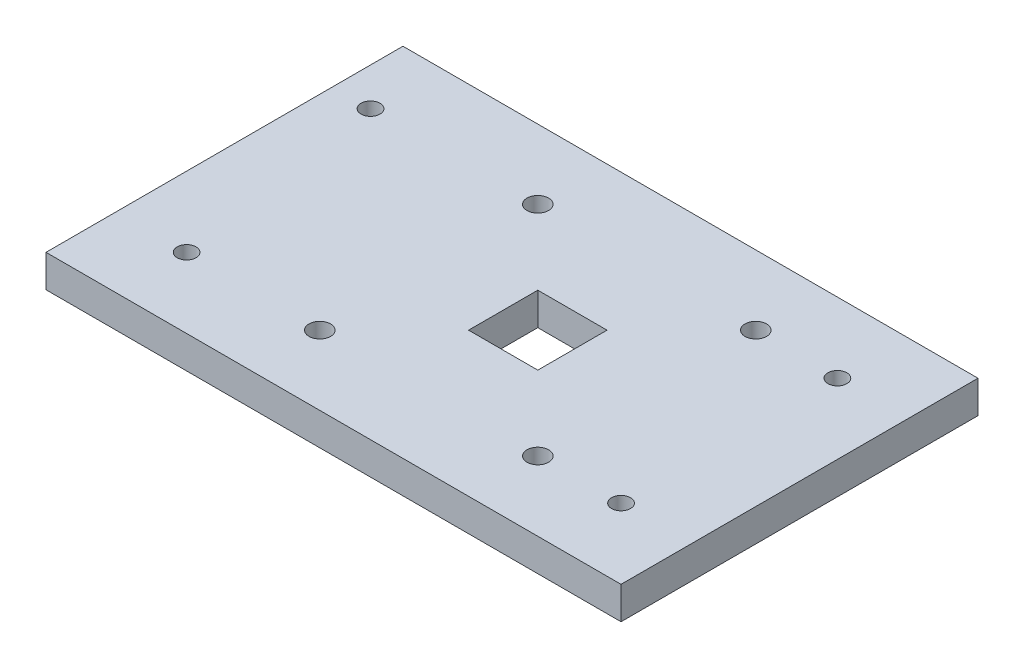
ISO-10303-21;
HEADER;
FILE_DESCRIPTION(('STEP AP214'),'2;1');
FILE_NAME('part.step','',(''),(''),'','','');
FILE_SCHEMA(('AUTOMOTIVE_DESIGN { 1 0 10303 214 1 1 1 1 }'));
ENDSEC;
DATA;
#1=APPLICATION_CONTEXT('core data for automotive mechanical design processes');
#2=APPLICATION_PROTOCOL_DEFINITION('international standard','automotive_design',2000,#1);
#3=PRODUCT_CONTEXT('',#1,'mechanical');
#4=PRODUCT('Part','Part','',(#3));
#5=PRODUCT_RELATED_PRODUCT_CATEGORY('part','',(#4));
#6=PRODUCT_DEFINITION_FORMATION('','',#4);
#7=PRODUCT_DEFINITION_CONTEXT('part definition',#1,'design');
#8=PRODUCT_DEFINITION('design','',#6,#7);
#9=PRODUCT_DEFINITION_SHAPE('','',#8);
#10=(LENGTH_UNIT() NAMED_UNIT(*) SI_UNIT(.MILLI.,.METRE.));
#11=(NAMED_UNIT(*) PLANE_ANGLE_UNIT() SI_UNIT($,.RADIAN.));
#12=(NAMED_UNIT(*) SI_UNIT($,.STERADIAN.) SOLID_ANGLE_UNIT());
#13=UNCERTAINTY_MEASURE_WITH_UNIT(LENGTH_MEASURE(1.E-05),#10,'distance_accuracy_value','');
#14=(GEOMETRIC_REPRESENTATION_CONTEXT(3) GLOBAL_UNCERTAINTY_ASSIGNED_CONTEXT((#13)) GLOBAL_UNIT_ASSIGNED_CONTEXT((#10,
#11,#12)) REPRESENTATION_CONTEXT('',''));
#15=CARTESIAN_POINT('',(0.,0.,0.));
#16=DIRECTION('',(0.,0.,1.));
#17=DIRECTION('',(1.,0.,0.));
#18=AXIS2_PLACEMENT_3D('',#15,#16,#17);
#19=CARTESIAN_POINT('',(0.,6.,0.));
#20=DIRECTION('',(0.,-1.,0.));
#21=DIRECTION('',(0.,0.,-1.));
#22=AXIS2_PLACEMENT_3D('',#19,#20,#21);
#23=PLANE('',#22);
#24=CARTESIAN_POINT('',(35.39,6.,-20.));
#25=DIRECTION('',(0.,1.,0.));
#26=DIRECTION('',(0.,0.,1.));
#27=AXIS2_PLACEMENT_3D('',#24,#25,#26);
#28=CIRCLE('',#27,1.75);
#29=CARTESIAN_POINT('',(35.39,6.,-18.25));
#30=VERTEX_POINT('',#29);
#31=EDGE_CURVE('E255',#30,#30,#28,.T.);
#32=ORIENTED_EDGE('',*,*,#31,.F.);
#33=EDGE_LOOP('',(#32));
#34=FACE_BOUND('',#33,.T.);
#35=CARTESIAN_POINT('',(35.39,6.,20.));
#36=DIRECTION('',(0.,1.,0.));
#37=DIRECTION('',(0.,0.,1.));
#38=AXIS2_PLACEMENT_3D('',#35,#36,#37);
#39=CIRCLE('',#38,1.75);
#40=CARTESIAN_POINT('',(35.39,6.,21.75));
#41=VERTEX_POINT('',#40);
#42=EDGE_CURVE('E257',#41,#41,#39,.T.);
#43=ORIENTED_EDGE('',*,*,#42,.F.);
#44=EDGE_LOOP('',(#43));
#45=FACE_BOUND('',#44,.T.);
#46=CARTESIAN_POINT('',(-44.93,6.,20.));
#47=DIRECTION('',(0.,1.,0.));
#48=DIRECTION('',(0.,0.,1.));
#49=AXIS2_PLACEMENT_3D('',#46,#47,#48);
#50=CIRCLE('',#49,1.75);
#51=CARTESIAN_POINT('',(-44.93,6.,21.75));
#52=VERTEX_POINT('',#51);
#53=EDGE_CURVE('E263',#52,#52,#50,.T.);
#54=ORIENTED_EDGE('',*,*,#53,.F.);
#55=EDGE_LOOP('',(#54));
#56=FACE_BOUND('',#55,.T.);
#57=CARTESIAN_POINT('',(-50.93,6.,-20.));
#58=DIRECTION('',(0.,1.,0.));
#59=DIRECTION('',(0.,0.,1.));
#60=AXIS2_PLACEMENT_3D('',#57,#58,#59);
#61=CIRCLE('',#60,1.75);
#62=CARTESIAN_POINT('',(-50.93,6.,-18.25));
#63=VERTEX_POINT('',#62);
#64=EDGE_CURVE('E269',#63,#63,#61,.T.);
#65=ORIENTED_EDGE('',*,*,#64,.F.);
#66=EDGE_LOOP('',(#65));
#67=FACE_BOUND('',#66,.T.);
#68=CARTESIAN_POINT('',(-20.1525432638164,6.,20.1525432638169));
#69=DIRECTION('',(0.,1.,0.));
#70=DIRECTION('',(0.,0.,1.));
#71=AXIS2_PLACEMENT_3D('',#68,#69,#70);
#72=CIRCLE('',#71,2.);
#73=CARTESIAN_POINT('',(-20.1525432638164,6.,22.1525432638169));
#74=VERTEX_POINT('',#73);
#75=EDGE_CURVE('E284',#74,#74,#72,.T.);
#76=ORIENTED_EDGE('',*,*,#75,.F.);
#77=EDGE_LOOP('',(#76));
#78=FACE_BOUND('',#77,.T.);
#79=CARTESIAN_POINT('',(20.1525432638166,6.,20.1525432638166));
#80=DIRECTION('',(0.,1.,0.));
#81=DIRECTION('',(0.,0.,1.));
#82=AXIS2_PLACEMENT_3D('',#79,#80,#81);
#83=CIRCLE('',#82,2.);
#84=CARTESIAN_POINT('',(20.1525432638166,6.,22.1525432638166));
#85=VERTEX_POINT('',#84);
#86=EDGE_CURVE('E126',#85,#85,#83,.T.);
#87=ORIENTED_EDGE('',*,*,#86,.F.);
#88=EDGE_LOOP('',(#87));
#89=FACE_BOUND('',#88,.T.);
#90=DIRECTION('',(0.,0.,1.));
#91=VECTOR('',#90,1.);
#92=CARTESIAN_POINT('',(-57.93,6.,33.));
#93=LINE('',#92,#91);
#94=CARTESIAN_POINT('',(-57.93,6.,-33.));
#95=VERTEX_POINT('',#94);
#96=CARTESIAN_POINT('',(-57.93,6.,33.));
#97=VERTEX_POINT('',#96);
#98=EDGE_CURVE('E136',#95,#97,#93,.T.);
#99=ORIENTED_EDGE('',*,*,#98,.T.);
#100=DIRECTION('',(1.,0.,0.));
#101=VECTOR('',#100,1.);
#102=CARTESIAN_POINT('',(-57.93,6.,33.));
#103=LINE('',#102,#101);
#104=CARTESIAN_POINT('',(48.39,6.,33.));
#105=VERTEX_POINT('',#104);
#106=EDGE_CURVE('E139',#97,#105,#103,.T.);
#107=ORIENTED_EDGE('',*,*,#106,.T.);
#108=DIRECTION('',(0.,0.,-1.));
#109=VECTOR('',#108,1.);
#110=CARTESIAN_POINT('',(48.39,6.,33.));
#111=LINE('',#110,#109);
#112=CARTESIAN_POINT('',(48.39,6.,-33.));
#113=VERTEX_POINT('',#112);
#114=EDGE_CURVE('E142',#105,#113,#111,.T.);
#115=ORIENTED_EDGE('',*,*,#114,.T.);
#116=DIRECTION('',(-1.,0.,0.));
#117=VECTOR('',#116,1.);
#118=CARTESIAN_POINT('',(-57.93,6.,-33.));
#119=LINE('',#118,#117);
#120=EDGE_CURVE('E144',#113,#95,#119,.T.);
#121=ORIENTED_EDGE('',*,*,#120,.T.);
#122=EDGE_LOOP('',(#99,#107,#115,#121));
#123=FACE_BOUND('',#122,.T.);
#124=DIRECTION('',(0.,0.,1.));
#125=VECTOR('',#124,1.);
#126=CARTESIAN_POINT('',(-6.4,6.,-6.4));
#127=LINE('',#126,#125);
#128=CARTESIAN_POINT('',(-6.4,6.,-6.4));
#129=VERTEX_POINT('',#128);
#130=CARTESIAN_POINT('',(-6.4,6.,6.4));
#131=VERTEX_POINT('',#130);
#132=EDGE_CURVE('E97',#129,#131,#127,.T.);
#133=ORIENTED_EDGE('',*,*,#132,.F.);
#134=DIRECTION('',(-1.,0.,0.));
#135=VECTOR('',#134,1.);
#136=CARTESIAN_POINT('',(-6.4,6.,-6.4));
#137=LINE('',#136,#135);
#138=CARTESIAN_POINT('',(6.4,6.,-6.4));
#139=VERTEX_POINT('',#138);
#140=EDGE_CURVE('E120',#139,#129,#137,.T.);
#141=ORIENTED_EDGE('',*,*,#140,.F.);
#142=DIRECTION('',(0.,0.,-1.));
#143=VECTOR('',#142,1.);
#144=CARTESIAN_POINT('',(6.4,6.,-6.4));
#145=LINE('',#144,#143);
#146=CARTESIAN_POINT('',(6.4,6.,6.4));
#147=VERTEX_POINT('',#146);
#148=EDGE_CURVE('E118',#147,#139,#145,.T.);
#149=ORIENTED_EDGE('',*,*,#148,.F.);
#150=DIRECTION('',(1.,0.,0.));
#151=VECTOR('',#150,1.);
#152=CARTESIAN_POINT('',(-6.4,6.,6.4));
#153=LINE('',#152,#151);
#154=EDGE_CURVE('E105',#131,#147,#153,.T.);
#155=ORIENTED_EDGE('',*,*,#154,.F.);
#156=EDGE_LOOP('',(#133,#141,#149,#155));
#157=FACE_BOUND('',#156,.T.);
#158=CARTESIAN_POINT('',(20.1525432638165,6.,-20.1525432638167));
#159=DIRECTION('',(0.,1.,0.));
#160=DIRECTION('',(0.,0.,1.));
#161=AXIS2_PLACEMENT_3D('',#158,#159,#160);
#162=CIRCLE('',#161,2.00000000000001);
#163=CARTESIAN_POINT('',(20.1525432638165,6.,-18.1525432638167));
#164=VERTEX_POINT('',#163);
#165=EDGE_CURVE('E290',#164,#164,#162,.T.);
#166=ORIENTED_EDGE('',*,*,#165,.F.);
#167=EDGE_LOOP('',(#166));
#168=FACE_BOUND('',#167,.T.);
#169=CARTESIAN_POINT('',(-20.1525432638166,6.,-20.1525432638166));
#170=DIRECTION('',(0.,1.,0.));
#171=DIRECTION('',(0.,0.,1.));
#172=AXIS2_PLACEMENT_3D('',#169,#170,#171);
#173=CIRCLE('',#172,2.);
#174=CARTESIAN_POINT('',(-20.1525432638166,6.,-18.1525432638166));
#175=VERTEX_POINT('',#174);
#176=EDGE_CURVE('E278',#175,#175,#173,.T.);
#177=ORIENTED_EDGE('',*,*,#176,.F.);
#178=EDGE_LOOP('',(#177));
#179=FACE_BOUND('',#178,.T.);
#180=ADVANCED_FACE('F32',(#34,#45,#56,#67,#78,#89,#123,#157,#168,#179),#23,.F.);
#181=CARTESIAN_POINT('',(0.,0.,0.));
#182=DIRECTION('',(0.,-1.,0.));
#183=DIRECTION('',(0.,0.,-1.));
#184=AXIS2_PLACEMENT_3D('',#181,#182,#183);
#185=PLANE('',#184);
#186=CARTESIAN_POINT('',(35.39,0.,-20.));
#187=DIRECTION('',(0.,1.,0.));
#188=DIRECTION('',(0.,0.,1.));
#189=AXIS2_PLACEMENT_3D('',#186,#187,#188);
#190=CIRCLE('',#189,1.75);
#191=CARTESIAN_POINT('',(35.39,0.,-18.25));
#192=VERTEX_POINT('',#191);
#193=EDGE_CURVE('E253',#192,#192,#190,.T.);
#194=ORIENTED_EDGE('',*,*,#193,.T.);
#195=EDGE_LOOP('',(#194));
#196=FACE_BOUND('',#195,.T.);
#197=CARTESIAN_POINT('',(35.39,0.,20.));
#198=DIRECTION('',(0.,1.,0.));
#199=DIRECTION('',(0.,0.,1.));
#200=AXIS2_PLACEMENT_3D('',#197,#198,#199);
#201=CIRCLE('',#200,1.75);
#202=CARTESIAN_POINT('',(35.39,0.,21.75));
#203=VERTEX_POINT('',#202);
#204=EDGE_CURVE('E260',#203,#203,#201,.T.);
#205=ORIENTED_EDGE('',*,*,#204,.T.);
#206=EDGE_LOOP('',(#205));
#207=FACE_BOUND('',#206,.T.);
#208=CARTESIAN_POINT('',(-44.93,0.,20.));
#209=DIRECTION('',(0.,1.,0.));
#210=DIRECTION('',(0.,0.,1.));
#211=AXIS2_PLACEMENT_3D('',#208,#209,#210);
#212=CIRCLE('',#211,1.75);
#213=CARTESIAN_POINT('',(-44.93,0.,21.75));
#214=VERTEX_POINT('',#213);
#215=EDGE_CURVE('E266',#214,#214,#212,.T.);
#216=ORIENTED_EDGE('',*,*,#215,.T.);
#217=EDGE_LOOP('',(#216));
#218=FACE_BOUND('',#217,.T.);
#219=CARTESIAN_POINT('',(-50.93,0.,-20.));
#220=DIRECTION('',(0.,1.,0.));
#221=DIRECTION('',(0.,0.,1.));
#222=AXIS2_PLACEMENT_3D('',#219,#220,#221);
#223=CIRCLE('',#222,1.75);
#224=CARTESIAN_POINT('',(-50.93,0.,-18.25));
#225=VERTEX_POINT('',#224);
#226=EDGE_CURVE('E272',#225,#225,#223,.T.);
#227=ORIENTED_EDGE('',*,*,#226,.T.);
#228=EDGE_LOOP('',(#227));
#229=FACE_BOUND('',#228,.T.);
#230=CARTESIAN_POINT('',(-20.1525432638164,0.,20.1525432638169));
#231=DIRECTION('',(0.,1.,0.));
#232=DIRECTION('',(0.,0.,1.));
#233=AXIS2_PLACEMENT_3D('',#230,#231,#232);
#234=CIRCLE('',#233,2.);
#235=CARTESIAN_POINT('',(-20.1525432638164,0.,22.1525432638169));
#236=VERTEX_POINT('',#235);
#237=EDGE_CURVE('E281',#236,#236,#234,.T.);
#238=ORIENTED_EDGE('',*,*,#237,.T.);
#239=EDGE_LOOP('',(#238));
#240=FACE_BOUND('',#239,.T.);
#241=CARTESIAN_POINT('',(20.1525432638166,0.,20.1525432638166));
#242=DIRECTION('',(0.,1.,0.));
#243=DIRECTION('',(0.,0.,1.));
#244=AXIS2_PLACEMENT_3D('',#241,#242,#243);
#245=CIRCLE('',#244,2.);
#246=CARTESIAN_POINT('',(20.1525432638166,0.,22.1525432638166));
#247=VERTEX_POINT('',#246);
#248=EDGE_CURVE('E293',#247,#247,#245,.T.);
#249=ORIENTED_EDGE('',*,*,#248,.T.);
#250=EDGE_LOOP('',(#249));
#251=FACE_BOUND('',#250,.T.);
#252=DIRECTION('',(0.,0.,1.));
#253=VECTOR('',#252,1.);
#254=CARTESIAN_POINT('',(-57.93,0.,33.));
#255=LINE('',#254,#253);
#256=CARTESIAN_POINT('',(-57.93,0.,-33.));
#257=VERTEX_POINT('',#256);
#258=CARTESIAN_POINT('',(-57.93,0.,33.));
#259=VERTEX_POINT('',#258);
#260=EDGE_CURVE('E113',#257,#259,#255,.T.);
#261=ORIENTED_EDGE('',*,*,#260,.F.);
#262=DIRECTION('',(-1.,0.,0.));
#263=VECTOR('',#262,1.);
#264=CARTESIAN_POINT('',(-57.93,0.,-33.));
#265=LINE('',#264,#263);
#266=CARTESIAN_POINT('',(48.39,0.,-33.));
#267=VERTEX_POINT('',#266);
#268=EDGE_CURVE('E140',#267,#257,#265,.T.);
#269=ORIENTED_EDGE('',*,*,#268,.F.);
#270=DIRECTION('',(0.,0.,-1.));
#271=VECTOR('',#270,1.);
#272=CARTESIAN_POINT('',(48.39,0.,33.));
#273=LINE('',#272,#271);
#274=CARTESIAN_POINT('',(48.39,0.,33.));
#275=VERTEX_POINT('',#274);
#276=EDGE_CURVE('E151',#275,#267,#273,.T.);
#277=ORIENTED_EDGE('',*,*,#276,.F.);
#278=DIRECTION('',(1.,0.,0.));
#279=VECTOR('',#278,1.);
#280=CARTESIAN_POINT('',(-57.93,0.,33.));
#281=LINE('',#280,#279);
#282=EDGE_CURVE('E149',#259,#275,#281,.T.);
#283=ORIENTED_EDGE('',*,*,#282,.F.);
#284=EDGE_LOOP('',(#261,#269,#277,#283));
#285=FACE_BOUND('',#284,.T.);
#286=DIRECTION('',(-1.,0.,0.));
#287=VECTOR('',#286,1.);
#288=CARTESIAN_POINT('',(-6.4,0.,-6.4));
#289=LINE('',#288,#287);
#290=CARTESIAN_POINT('',(6.4,0.,-6.4));
#291=VERTEX_POINT('',#290);
#292=CARTESIAN_POINT('',(-6.4,0.,-6.4));
#293=VERTEX_POINT('',#292);
#294=EDGE_CURVE('E106',#291,#293,#289,.T.);
#295=ORIENTED_EDGE('',*,*,#294,.T.);
#296=DIRECTION('',(0.,0.,1.));
#297=VECTOR('',#296,1.);
#298=CARTESIAN_POINT('',(-6.4,0.,-6.4));
#299=LINE('',#298,#297);
#300=CARTESIAN_POINT('',(-6.4,0.,6.4));
#301=VERTEX_POINT('',#300);
#302=EDGE_CURVE('E55',#293,#301,#299,.T.);
#303=ORIENTED_EDGE('',*,*,#302,.T.);
#304=DIRECTION('',(1.,0.,0.));
#305=VECTOR('',#304,1.);
#306=CARTESIAN_POINT('',(-6.4,0.,6.4));
#307=LINE('',#306,#305);
#308=CARTESIAN_POINT('',(6.4,0.,6.4));
#309=VERTEX_POINT('',#308);
#310=EDGE_CURVE('E112',#301,#309,#307,.T.);
#311=ORIENTED_EDGE('',*,*,#310,.T.);
#312=DIRECTION('',(0.,0.,-1.));
#313=VECTOR('',#312,1.);
#314=CARTESIAN_POINT('',(6.4,0.,-6.4));
#315=LINE('',#314,#313);
#316=EDGE_CURVE('E128',#309,#291,#315,.T.);
#317=ORIENTED_EDGE('',*,*,#316,.T.);
#318=EDGE_LOOP('',(#295,#303,#311,#317));
#319=FACE_BOUND('',#318,.T.);
#320=CARTESIAN_POINT('',(20.1525432638165,0.,-20.1525432638167));
#321=DIRECTION('',(0.,1.,0.));
#322=DIRECTION('',(0.,0.,1.));
#323=AXIS2_PLACEMENT_3D('',#320,#321,#322);
#324=CIRCLE('',#323,2.00000000000001);
#325=CARTESIAN_POINT('',(20.1525432638165,0.,-18.1525432638167));
#326=VERTEX_POINT('',#325);
#327=EDGE_CURVE('E287',#326,#326,#324,.T.);
#328=ORIENTED_EDGE('',*,*,#327,.T.);
#329=EDGE_LOOP('',(#328));
#330=FACE_BOUND('',#329,.T.);
#331=CARTESIAN_POINT('',(-20.1525432638166,0.,-20.1525432638166));
#332=DIRECTION('',(0.,1.,0.));
#333=DIRECTION('',(0.,0.,1.));
#334=AXIS2_PLACEMENT_3D('',#331,#332,#333);
#335=CIRCLE('',#334,2.);
#336=CARTESIAN_POINT('',(-20.1525432638166,0.,-18.1525432638166));
#337=VERTEX_POINT('',#336);
#338=EDGE_CURVE('E275',#337,#337,#335,.T.);
#339=ORIENTED_EDGE('',*,*,#338,.T.);
#340=EDGE_LOOP('',(#339));
#341=FACE_BOUND('',#340,.T.);
#342=ADVANCED_FACE('F169',(#196,#207,#218,#229,#240,#251,#285,#319,#330,#341),#185,.T.);
#343=CARTESIAN_POINT('',(-57.93,6.,33.));
#344=DIRECTION('',(1.,0.,0.));
#345=DIRECTION('',(0.,0.,-1.));
#346=AXIS2_PLACEMENT_3D('',#343,#344,#345);
#347=PLANE('',#346);
#348=ORIENTED_EDGE('',*,*,#260,.T.);
#349=DIRECTION('',(0.,-1.,0.));
#350=VECTOR('',#349,1.);
#351=CARTESIAN_POINT('',(-57.93,6.,33.));
#352=LINE('',#351,#350);
#353=EDGE_CURVE('E11',#97,#259,#352,.T.);
#354=ORIENTED_EDGE('',*,*,#353,.F.);
#355=ORIENTED_EDGE('',*,*,#98,.F.);
#356=DIRECTION('',(0.,-1.,0.));
#357=VECTOR('',#356,1.);
#358=CARTESIAN_POINT('',(-57.93,6.,-33.));
#359=LINE('',#358,#357);
#360=EDGE_CURVE('E146',#95,#257,#359,.T.);
#361=ORIENTED_EDGE('',*,*,#360,.T.);
#362=EDGE_LOOP('',(#348,#354,#355,#361));
#363=FACE_BOUND('',#362,.T.);
#364=ADVANCED_FACE('F34',(#363),#347,.F.);
#365=CARTESIAN_POINT('',(-57.93,6.,33.));
#366=DIRECTION('',(0.,0.,-1.));
#367=DIRECTION('',(-1.,0.,0.));
#368=AXIS2_PLACEMENT_3D('',#365,#366,#367);
#369=PLANE('',#368);
#370=ORIENTED_EDGE('',*,*,#282,.T.);
#371=DIRECTION('',(0.,-1.,0.));
#372=VECTOR('',#371,1.);
#373=CARTESIAN_POINT('',(48.39,6.,33.));
#374=LINE('',#373,#372);
#375=EDGE_CURVE('E40',#105,#275,#374,.T.);
#376=ORIENTED_EDGE('',*,*,#375,.F.);
#377=ORIENTED_EDGE('',*,*,#106,.F.);
#378=ORIENTED_EDGE('',*,*,#353,.T.);
#379=EDGE_LOOP('',(#370,#376,#377,#378));
#380=FACE_BOUND('',#379,.T.);
#381=ADVANCED_FACE('F179',(#380),#369,.F.);
#382=CARTESIAN_POINT('',(48.39,6.,33.));
#383=DIRECTION('',(-1.,0.,0.));
#384=DIRECTION('',(0.,0.,1.));
#385=AXIS2_PLACEMENT_3D('',#382,#383,#384);
#386=PLANE('',#385);
#387=ORIENTED_EDGE('',*,*,#276,.T.);
#388=DIRECTION('',(0.,-1.,0.));
#389=VECTOR('',#388,1.);
#390=CARTESIAN_POINT('',(48.39,6.,-33.));
#391=LINE('',#390,#389);
#392=EDGE_CURVE('E156',#113,#267,#391,.T.);
#393=ORIENTED_EDGE('',*,*,#392,.F.);
#394=ORIENTED_EDGE('',*,*,#114,.F.);
#395=ORIENTED_EDGE('',*,*,#375,.T.);
#396=EDGE_LOOP('',(#387,#393,#394,#395));
#397=FACE_BOUND('',#396,.T.);
#398=ADVANCED_FACE('F163',(#397),#386,.F.);
#399=CARTESIAN_POINT('',(-57.93,6.,-33.));
#400=DIRECTION('',(0.,0.,1.));
#401=DIRECTION('',(1.,0.,0.));
#402=AXIS2_PLACEMENT_3D('',#399,#400,#401);
#403=PLANE('',#402);
#404=ORIENTED_EDGE('',*,*,#268,.T.);
#405=ORIENTED_EDGE('',*,*,#360,.F.);
#406=ORIENTED_EDGE('',*,*,#120,.F.);
#407=ORIENTED_EDGE('',*,*,#392,.T.);
#408=EDGE_LOOP('',(#404,#405,#406,#407));
#409=FACE_BOUND('',#408,.T.);
#410=ADVANCED_FACE('F173',(#409),#403,.F.);
#411=CARTESIAN_POINT('',(-6.4,6.,-6.4));
#412=DIRECTION('',(1.,0.,0.));
#413=DIRECTION('',(0.,0.,-1.));
#414=AXIS2_PLACEMENT_3D('',#411,#412,#413);
#415=PLANE('',#414);
#416=ORIENTED_EDGE('',*,*,#302,.F.);
#417=DIRECTION('',(0.,-1.,0.));
#418=VECTOR('',#417,1.);
#419=CARTESIAN_POINT('',(-6.4,6.,-6.4));
#420=LINE('',#419,#418);
#421=EDGE_CURVE('E101',#129,#293,#420,.T.);
#422=ORIENTED_EDGE('',*,*,#421,.F.);
#423=ORIENTED_EDGE('',*,*,#132,.T.);
#424=DIRECTION('',(0.,-1.,0.));
#425=VECTOR('',#424,1.);
#426=CARTESIAN_POINT('',(-6.4,6.,6.4));
#427=LINE('',#426,#425);
#428=EDGE_CURVE('E100',#131,#301,#427,.T.);
#429=ORIENTED_EDGE('',*,*,#428,.T.);
#430=EDGE_LOOP('',(#416,#422,#423,#429));
#431=FACE_BOUND('',#430,.T.);
#432=ADVANCED_FACE('F99',(#431),#415,.T.);
#433=CARTESIAN_POINT('',(-6.4,6.,6.4));
#434=DIRECTION('',(0.,0.,-1.));
#435=DIRECTION('',(-1.,0.,0.));
#436=AXIS2_PLACEMENT_3D('',#433,#434,#435);
#437=PLANE('',#436);
#438=ORIENTED_EDGE('',*,*,#310,.F.);
#439=ORIENTED_EDGE('',*,*,#428,.F.);
#440=ORIENTED_EDGE('',*,*,#154,.T.);
#441=DIRECTION('',(0.,-1.,0.));
#442=VECTOR('',#441,1.);
#443=CARTESIAN_POINT('',(6.4,6.,6.4));
#444=LINE('',#443,#442);
#445=EDGE_CURVE('E114',#147,#309,#444,.T.);
#446=ORIENTED_EDGE('',*,*,#445,.T.);
#447=EDGE_LOOP('',(#438,#439,#440,#446));
#448=FACE_BOUND('',#447,.T.);
#449=ADVANCED_FACE('F109',(#448),#437,.T.);
#450=CARTESIAN_POINT('',(6.4,6.,-6.4));
#451=DIRECTION('',(-1.,0.,0.));
#452=DIRECTION('',(0.,0.,1.));
#453=AXIS2_PLACEMENT_3D('',#450,#451,#452);
#454=PLANE('',#453);
#455=ORIENTED_EDGE('',*,*,#316,.F.);
#456=ORIENTED_EDGE('',*,*,#445,.F.);
#457=ORIENTED_EDGE('',*,*,#148,.T.);
#458=DIRECTION('',(0.,-1.,0.));
#459=VECTOR('',#458,1.);
#460=CARTESIAN_POINT('',(6.4,6.,-6.4));
#461=LINE('',#460,#459);
#462=EDGE_CURVE('E47',#139,#291,#461,.T.);
#463=ORIENTED_EDGE('',*,*,#462,.T.);
#464=EDGE_LOOP('',(#455,#456,#457,#463));
#465=FACE_BOUND('',#464,.T.);
#466=ADVANCED_FACE('F207',(#465),#454,.T.);
#467=CARTESIAN_POINT('',(-6.4,6.,-6.4));
#468=DIRECTION('',(0.,0.,1.));
#469=DIRECTION('',(1.,0.,0.));
#470=AXIS2_PLACEMENT_3D('',#467,#468,#469);
#471=PLANE('',#470);
#472=ORIENTED_EDGE('',*,*,#294,.F.);
#473=ORIENTED_EDGE('',*,*,#462,.F.);
#474=ORIENTED_EDGE('',*,*,#140,.T.);
#475=ORIENTED_EDGE('',*,*,#421,.T.);
#476=EDGE_LOOP('',(#472,#473,#474,#475));
#477=FACE_BOUND('',#476,.T.);
#478=ADVANCED_FACE('F211',(#477),#471,.T.);
#479=CARTESIAN_POINT('',(20.1525432638166,6.,20.1525432638166));
#480=DIRECTION('',(0.,-1.,0.));
#481=DIRECTION('',(0.,0.,-1.));
#482=AXIS2_PLACEMENT_3D('',#479,#480,#481);
#483=CYLINDRICAL_SURFACE('',#482,2.);
#484=ORIENTED_EDGE('',*,*,#86,.T.);
#485=EDGE_LOOP('',(#484));
#486=FACE_BOUND('',#485,.T.);
#487=ORIENTED_EDGE('',*,*,#248,.F.);
#488=EDGE_LOOP('',(#487));
#489=FACE_BOUND('',#488,.T.);
#490=ADVANCED_FACE('F217',(#486,#489),#483,.F.);
#491=CARTESIAN_POINT('',(20.1525432638165,6.,-20.1525432638167));
#492=DIRECTION('',(0.,-1.,0.));
#493=DIRECTION('',(0.,0.,-1.));
#494=AXIS2_PLACEMENT_3D('',#491,#492,#493);
#495=CYLINDRICAL_SURFACE('',#494,2.00000000000001);
#496=ORIENTED_EDGE('',*,*,#165,.T.);
#497=EDGE_LOOP('',(#496));
#498=FACE_BOUND('',#497,.T.);
#499=ORIENTED_EDGE('',*,*,#327,.F.);
#500=EDGE_LOOP('',(#499));
#501=FACE_BOUND('',#500,.T.);
#502=ADVANCED_FACE('F220',(#498,#501),#495,.F.);
#503=CARTESIAN_POINT('',(-20.1525432638164,6.,20.1525432638169));
#504=DIRECTION('',(0.,-1.,0.));
#505=DIRECTION('',(0.,0.,-1.));
#506=AXIS2_PLACEMENT_3D('',#503,#504,#505);
#507=CYLINDRICAL_SURFACE('',#506,2.);
#508=ORIENTED_EDGE('',*,*,#75,.T.);
#509=EDGE_LOOP('',(#508));
#510=FACE_BOUND('',#509,.T.);
#511=ORIENTED_EDGE('',*,*,#237,.F.);
#512=EDGE_LOOP('',(#511));
#513=FACE_BOUND('',#512,.T.);
#514=ADVANCED_FACE('F224',(#510,#513),#507,.F.);
#515=CARTESIAN_POINT('',(-20.1525432638166,6.,-20.1525432638166));
#516=DIRECTION('',(0.,-1.,0.));
#517=DIRECTION('',(0.,0.,-1.));
#518=AXIS2_PLACEMENT_3D('',#515,#516,#517);
#519=CYLINDRICAL_SURFACE('',#518,2.);
#520=ORIENTED_EDGE('',*,*,#176,.T.);
#521=EDGE_LOOP('',(#520));
#522=FACE_BOUND('',#521,.T.);
#523=ORIENTED_EDGE('',*,*,#338,.F.);
#524=EDGE_LOOP('',(#523));
#525=FACE_BOUND('',#524,.T.);
#526=ADVANCED_FACE('F228',(#522,#525),#519,.F.);
#527=CARTESIAN_POINT('',(-50.93,0.,-20.));
#528=DIRECTION('',(0.,1.,0.));
#529=DIRECTION('',(0.,0.,1.));
#530=AXIS2_PLACEMENT_3D('',#527,#528,#529);
#531=CYLINDRICAL_SURFACE('',#530,1.75);
#532=ORIENTED_EDGE('',*,*,#226,.F.);
#533=EDGE_LOOP('',(#532));
#534=FACE_BOUND('',#533,.T.);
#535=ORIENTED_EDGE('',*,*,#64,.T.);
#536=EDGE_LOOP('',(#535));
#537=FACE_BOUND('',#536,.T.);
#538=ADVANCED_FACE('F232',(#534,#537),#531,.F.);
#539=CARTESIAN_POINT('',(-44.93,0.,20.));
#540=DIRECTION('',(0.,1.,0.));
#541=DIRECTION('',(0.,0.,1.));
#542=AXIS2_PLACEMENT_3D('',#539,#540,#541);
#543=CYLINDRICAL_SURFACE('',#542,1.75);
#544=ORIENTED_EDGE('',*,*,#215,.F.);
#545=EDGE_LOOP('',(#544));
#546=FACE_BOUND('',#545,.T.);
#547=ORIENTED_EDGE('',*,*,#53,.T.);
#548=EDGE_LOOP('',(#547));
#549=FACE_BOUND('',#548,.T.);
#550=ADVANCED_FACE('F236',(#546,#549),#543,.F.);
#551=CARTESIAN_POINT('',(35.39,0.,20.));
#552=DIRECTION('',(0.,1.,0.));
#553=DIRECTION('',(0.,0.,1.));
#554=AXIS2_PLACEMENT_3D('',#551,#552,#553);
#555=CYLINDRICAL_SURFACE('',#554,1.75);
#556=ORIENTED_EDGE('',*,*,#204,.F.);
#557=EDGE_LOOP('',(#556));
#558=FACE_BOUND('',#557,.T.);
#559=ORIENTED_EDGE('',*,*,#42,.T.);
#560=EDGE_LOOP('',(#559));
#561=FACE_BOUND('',#560,.T.);
#562=ADVANCED_FACE('F240',(#558,#561),#555,.F.);
#563=CARTESIAN_POINT('',(35.39,0.,-20.));
#564=DIRECTION('',(0.,1.,0.));
#565=DIRECTION('',(0.,0.,1.));
#566=AXIS2_PLACEMENT_3D('',#563,#564,#565);
#567=CYLINDRICAL_SURFACE('',#566,1.75);
#568=ORIENTED_EDGE('',*,*,#193,.F.);
#569=EDGE_LOOP('',(#568));
#570=FACE_BOUND('',#569,.T.);
#571=ORIENTED_EDGE('',*,*,#31,.T.);
#572=EDGE_LOOP('',(#571));
#573=FACE_BOUND('',#572,.T.);
#574=ADVANCED_FACE('F244',(#570,#573),#567,.F.);
#575=CLOSED_SHELL('',(#180,#342,#364,#381,#398,#410,#432,#449,#466,#478,#490,#502,#514,#526,
#538,#550,#562,#574));
#576=MANIFOLD_SOLID_BREP('B2',#575);
#577=ADVANCED_BREP_SHAPE_REPRESENTATION('',(#18,#576),#14);
#578=SHAPE_DEFINITION_REPRESENTATION(#9,#577);
ENDSEC;
END-ISO-10303-21;
